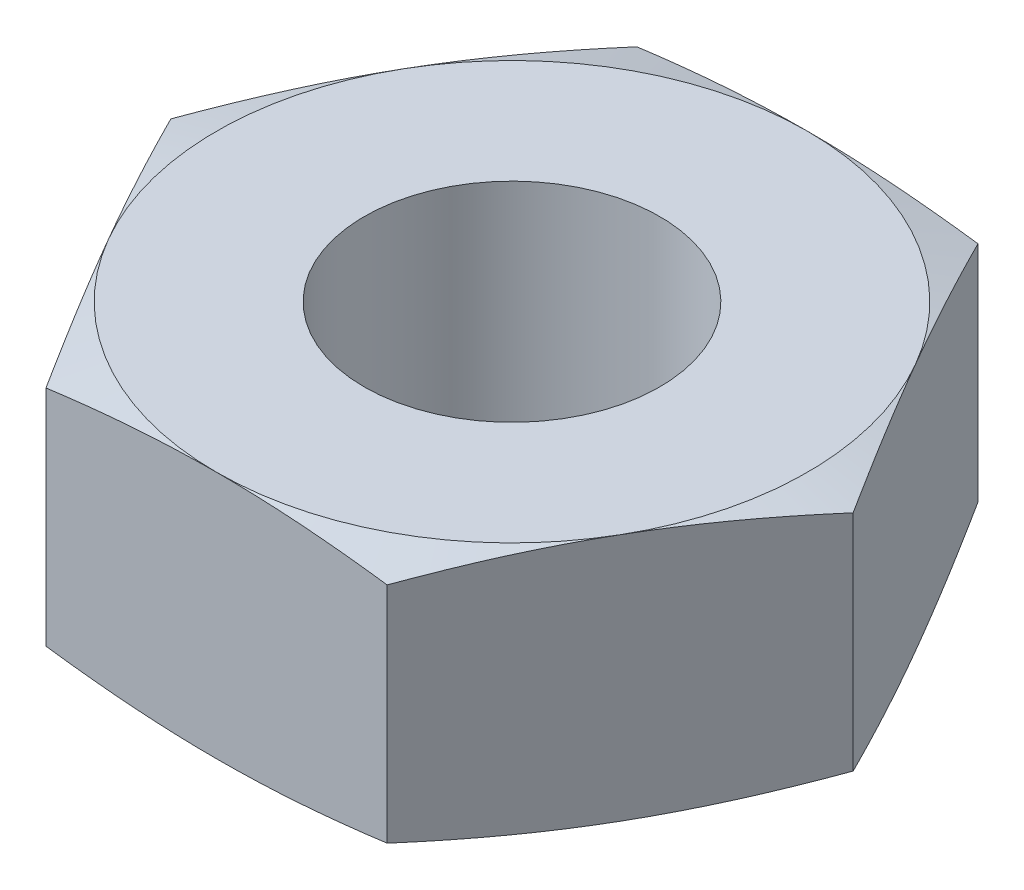
ISO-10303-21;
HEADER;
FILE_DESCRIPTION(('STEP AP214'),'2;1');
FILE_NAME('part.step','',(''),(''),'','','');
FILE_SCHEMA(('AUTOMOTIVE_DESIGN { 1 0 10303 214 1 1 1 1 }'));
ENDSEC;
DATA;
#1=APPLICATION_CONTEXT('core data for automotive mechanical design processes');
#2=APPLICATION_PROTOCOL_DEFINITION('international standard','automotive_design',2000,#1);
#3=PRODUCT_CONTEXT('',#1,'mechanical');
#4=PRODUCT('Part','Part','',(#3));
#5=PRODUCT_RELATED_PRODUCT_CATEGORY('part','',(#4));
#6=PRODUCT_DEFINITION_FORMATION('','',#4);
#7=PRODUCT_DEFINITION_CONTEXT('part definition',#1,'design');
#8=PRODUCT_DEFINITION('design','',#6,#7);
#9=PRODUCT_DEFINITION_SHAPE('','',#8);
#10=(LENGTH_UNIT() NAMED_UNIT(*) SI_UNIT(.MILLI.,.METRE.));
#11=(NAMED_UNIT(*) PLANE_ANGLE_UNIT() SI_UNIT($,.RADIAN.));
#12=(NAMED_UNIT(*) SI_UNIT($,.STERADIAN.) SOLID_ANGLE_UNIT());
#13=UNCERTAINTY_MEASURE_WITH_UNIT(LENGTH_MEASURE(1.E-05),#10,'distance_accuracy_value','');
#14=(GEOMETRIC_REPRESENTATION_CONTEXT(3) GLOBAL_UNCERTAINTY_ASSIGNED_CONTEXT((#13)) GLOBAL_UNIT_ASSIGNED_CONTEXT((#10,
#11,#12)) REPRESENTATION_CONTEXT('',''));
#15=CARTESIAN_POINT('',(0.,0.,0.));
#16=DIRECTION('',(0.,0.,1.));
#17=DIRECTION('',(1.,0.,0.));
#18=AXIS2_PLACEMENT_3D('',#15,#16,#17);
#19=CARTESIAN_POINT('',(0.,2.1,0.));
#20=DIRECTION('',(0.,1.,0.));
#21=DIRECTION('',(0.,0.,1.));
#22=AXIS2_PLACEMENT_3D('',#19,#20,#21);
#23=PLANE('',#22);
#24=CARTESIAN_POINT('',(0.,2.1,0.));
#25=DIRECTION('',(0.,1.,0.));
#26=DIRECTION('',(0.,0.,1.));
#27=AXIS2_PLACEMENT_3D('',#24,#25,#26);
#28=CIRCLE('',#27,1.25);
#29=CARTESIAN_POINT('',(0.,2.1,1.25));
#30=VERTEX_POINT('',#29);
#31=EDGE_CURVE('E259',#30,#30,#28,.T.);
#32=ORIENTED_EDGE('',*,*,#31,.F.);
#33=EDGE_LOOP('',(#32));
#34=FACE_BOUND('',#33,.T.);
#35=CARTESIAN_POINT('',(0.,2.1,0.));
#36=DIRECTION('',(0.,1.,0.));
#37=DIRECTION('',(0.,0.,1.));
#38=AXIS2_PLACEMENT_3D('',#35,#36,#37);
#39=CIRCLE('',#38,2.5);
#40=CARTESIAN_POINT('',(0.,2.1,2.5));
#41=VERTEX_POINT('',#40);
#42=CARTESIAN_POINT('',(-2.1650635094611,2.1,1.25));
#43=VERTEX_POINT('',#42);
#44=EDGE_CURVE('E11',#41,#43,#39,.F.);
#45=ORIENTED_EDGE('',*,*,#44,.F.);
#46=CARTESIAN_POINT('',(0.,2.1,0.));
#47=DIRECTION('',(0.,1.,0.));
#48=DIRECTION('',(0.,0.,1.));
#49=AXIS2_PLACEMENT_3D('',#46,#47,#48);
#50=CIRCLE('',#49,2.5);
#51=CARTESIAN_POINT('',(2.1650635094611,2.1,1.25));
#52=VERTEX_POINT('',#51);
#53=EDGE_CURVE('E158',#41,#52,#50,.T.);
#54=ORIENTED_EDGE('',*,*,#53,.T.);
#55=CARTESIAN_POINT('',(2.1650635094611,2.1,-1.25));
#56=VERTEX_POINT('',#55);
#57=EDGE_CURVE('E52',#56,#52,#39,.F.);
#58=ORIENTED_EDGE('',*,*,#57,.F.);
#59=CARTESIAN_POINT('',(0.,2.1,-2.5));
#60=VERTEX_POINT('',#59);
#61=EDGE_CURVE('E283',#60,#56,#39,.F.);
#62=ORIENTED_EDGE('',*,*,#61,.F.);
#63=CARTESIAN_POINT('',(-2.1650635094611,2.1,-1.25));
#64=VERTEX_POINT('',#63);
#65=EDGE_CURVE('E326',#64,#60,#39,.F.);
#66=ORIENTED_EDGE('',*,*,#65,.F.);
#67=EDGE_CURVE('E55',#43,#64,#39,.F.);
#68=ORIENTED_EDGE('',*,*,#67,.F.);
#69=EDGE_LOOP('',(#45,#54,#58,#62,#66,#68));
#70=FACE_BOUND('',#69,.T.);
#71=ADVANCED_FACE('F43',(#34,#70),#23,.T.);
#72=CARTESIAN_POINT('',(0.,0.,0.));
#73=DIRECTION('',(0.,1.,0.));
#74=DIRECTION('',(0.,0.,1.));
#75=AXIS2_PLACEMENT_3D('',#72,#73,#74);
#76=PLANE('',#75);
#77=CARTESIAN_POINT('',(0.,0.,0.));
#78=DIRECTION('',(0.,1.,0.));
#79=DIRECTION('',(0.,0.,1.));
#80=AXIS2_PLACEMENT_3D('',#77,#78,#79);
#81=CIRCLE('',#80,1.25);
#82=CARTESIAN_POINT('',(0.,0.,1.25));
#83=VERTEX_POINT('',#82);
#84=EDGE_CURVE('E265',#83,#83,#81,.T.);
#85=ORIENTED_EDGE('',*,*,#84,.T.);
#86=EDGE_LOOP('',(#85));
#87=FACE_BOUND('',#86,.T.);
#88=CARTESIAN_POINT('',(0.,0.,0.));
#89=DIRECTION('',(0.,1.,0.));
#90=DIRECTION('',(0.,0.,1.));
#91=AXIS2_PLACEMENT_3D('',#88,#89,#90);
#92=CIRCLE('',#91,2.5);
#93=CARTESIAN_POINT('',(0.,0.,2.5));
#94=VERTEX_POINT('',#93);
#95=CARTESIAN_POINT('',(2.1650635094611,0.,1.25));
#96=VERTEX_POINT('',#95);
#97=EDGE_CURVE('E151',#94,#96,#92,.T.);
#98=ORIENTED_EDGE('',*,*,#97,.F.);
#99=CARTESIAN_POINT('',(0.,0.,0.));
#100=DIRECTION('',(0.,1.,0.));
#101=DIRECTION('',(0.,0.,1.));
#102=AXIS2_PLACEMENT_3D('',#99,#100,#101);
#103=CIRCLE('',#102,2.5);
#104=CARTESIAN_POINT('',(-2.1650635094611,0.,1.25));
#105=VERTEX_POINT('',#104);
#106=EDGE_CURVE('E164',#94,#105,#103,.F.);
#107=ORIENTED_EDGE('',*,*,#106,.T.);
#108=CARTESIAN_POINT('',(-2.1650635094611,0.,-1.25));
#109=VERTEX_POINT('',#108);
#110=EDGE_CURVE('E279',#105,#109,#103,.F.);
#111=ORIENTED_EDGE('',*,*,#110,.T.);
#112=CARTESIAN_POINT('',(0.,0.,-2.5));
#113=VERTEX_POINT('',#112);
#114=EDGE_CURVE('E285',#109,#113,#103,.F.);
#115=ORIENTED_EDGE('',*,*,#114,.T.);
#116=CARTESIAN_POINT('',(2.1650635094611,0.,-1.25));
#117=VERTEX_POINT('',#116);
#118=EDGE_CURVE('E162',#113,#117,#103,.F.);
#119=ORIENTED_EDGE('',*,*,#118,.T.);
#120=EDGE_CURVE('E139',#117,#96,#103,.F.);
#121=ORIENTED_EDGE('',*,*,#120,.T.);
#122=EDGE_LOOP('',(#98,#107,#111,#115,#119,#121));
#123=FACE_BOUND('',#122,.T.);
#124=ADVANCED_FACE('F159',(#87,#123),#76,.F.);
#125=CARTESIAN_POINT('',(0.,2.1,0.));
#126=DIRECTION('',(0.,1.,0.));
#127=DIRECTION('',(0.,0.,1.));
#128=AXIS2_PLACEMENT_3D('',#125,#126,#127);
#129=CYLINDRICAL_SURFACE('',#128,1.25);
#130=ORIENTED_EDGE('',*,*,#84,.F.);
#131=EDGE_LOOP('',(#130));
#132=FACE_BOUND('',#131,.T.);
#133=ORIENTED_EDGE('',*,*,#31,.T.);
#134=EDGE_LOOP('',(#133));
#135=FACE_BOUND('',#134,.T.);
#136=ADVANCED_FACE('F195',(#132,#135),#129,.F.);
#137=CARTESIAN_POINT('',(0.,0.,0.));
#138=DIRECTION('',(0.,1.,0.));
#139=DIRECTION('',(0.,0.,1.));
#140=AXIS2_PLACEMENT_3D('',#137,#138,#139);
#141=CONICAL_SURFACE('',#140,2.5,1.30899693899574);
#142=CARTESIAN_POINT('',(-4.3712350475131,0.679423372215923,2.5));
#143=CARTESIAN_POINT('',(-4.26551433291152,0.654835283850598,2.5));
#144=CARTESIAN_POINT('',(-4.15974613150584,0.630451423546869,2.5));
#145=CARTESIAN_POINT('',(-3.94809483123509,0.582179859675812,2.5));
#146=CARTESIAN_POINT('',(-3.84221173052944,0.558292164183879,2.5));
#147=CARTESIAN_POINT('',(-3.52432514486568,0.487497117461189,2.5));
#148=CARTESIAN_POINT('',(-3.31212448441136,0.441467204275446,2.5));
#149=CARTESIAN_POINT('',(-2.88500139302484,0.352382090715466,2.5));
#150=CARTESIAN_POINT('',(-2.67007218491964,0.309359092584015,2.5));
#151=CARTESIAN_POINT('',(-2.2392063533858,0.228471660371487,2.5));
#152=CARTESIAN_POINT('',(-2.02326964124852,0.190607689748078,2.5));
#153=CARTESIAN_POINT('',(-1.59602529116294,0.123552258428044,2.5));
#154=CARTESIAN_POINT('',(-1.38475101184777,0.0941533743212326,2.5));
#155=CARTESIAN_POINT('',(-0.960988743608423,0.0459589657265004,2.5));
#156=CARTESIAN_POINT('',(-0.748501162895277,0.0271600653836444,2.5));
#157=CARTESIAN_POINT('',(-0.429666662596568,0.00925008349405404,2.5));
#158=CARTESIAN_POINT('',(-0.323601530991883,0.00499298887421524,2.5));
#159=CARTESIAN_POINT('',(-0.111385131410139,6.74118896243829E-05,2.5));
#160=CARTESIAN_POINT('',(-0.00523386386546361,-0.000601088379031025,2.5));
#161=CARTESIAN_POINT('',(0.207036213487213,0.00169184566061242,2.5));
#162=CARTESIAN_POINT('',(0.313155020383301,0.00465354320105018,2.5));
#163=CARTESIAN_POINT('',(0.525235296004603,0.014050004975312,2.5));
#164=CARTESIAN_POINT('',(0.631196764835219,0.0204847668814326,2.5));
#165=CARTESIAN_POINT('',(0.88885387992793,0.0400086756720292,2.5));
#166=CARTESIAN_POINT('',(1.04042248684079,0.0547741958964136,2.5));
#167=CARTESIAN_POINT('',(1.34292021156248,0.0896456156755545,2.5));
#168=CARTESIAN_POINT('',(1.49384935133984,0.109751330234546,2.5));
#169=CARTESIAN_POINT('',(1.79556831872567,0.154179595891873,2.5));
#170=CARTESIAN_POINT('',(1.94635616677979,0.178515391424525,2.5));
#171=CARTESIAN_POINT('',(2.24738817378403,0.230350760958722,2.5));
#172=CARTESIAN_POINT('',(2.39763230519546,0.257850492959668,2.5));
#173=CARTESIAN_POINT('',(2.70076543170808,0.315824485387797,2.5));
#174=CARTESIAN_POINT('',(2.85364483504102,0.346348515840964,2.5));
#175=CARTESIAN_POINT('',(3.15901863091299,0.409263443255877,2.5));
#176=CARTESIAN_POINT('',(3.3115130190346,0.441654361536492,2.5));
#177=CARTESIAN_POINT('',(3.61535530056918,0.507668546812496,2.5));
#178=CARTESIAN_POINT('',(3.76670488717378,0.541284057339461,2.5));
#179=CARTESIAN_POINT('',(4.06914616411175,0.60960869991724,2.5));
#180=CARTESIAN_POINT('',(4.22023787189201,0.644317754619726,2.5));
#181=CARTESIAN_POINT('',(4.3712350475131,0.679423372215923,2.5));
#182=B_SPLINE_CURVE_WITH_KNOTS('',3,(#142,#143,#144,#145,#146,#147,#148,#149,#150,#151,#152,
#153,#154,#155,#156,#157,#158,#159,#160,#161,#162,#163,#164,#165,#166,#167,#168,#169,#170,#171,
#172,#173,#174,#175,#176,#177,#178,#179,#180,#181),.UNSPECIFIED.,.F.,.F.,(4,2,2,2,2,2,2,2,2,2,2,
2,2,2,2,2,2,2,2,4),(0.,0.325626625694674,0.651258547022556,1.30264596765056,1.96018571580165,
2.61778449469,3.25754187391862,3.89709538965373,4.21549355816424,4.53389013814877,
4.85230980700493,5.17072926245139,5.62746106131332,6.08417704007103,6.5423496438233,
7.00054513755567,7.46822044928546,7.93590110267772,8.40100988776508,8.86608584841109),.UNSPECIFIED.);
#183=CARTESIAN_POINT('',(1.44337567297406,0.103629710818453,2.5));
#184=VERTEX_POINT('',#183);
#185=EDGE_CURVE('E152',#94,#184,#182,.T.);
#186=ORIENTED_EDGE('',*,*,#185,.F.);
#187=ORIENTED_EDGE('',*,*,#97,.T.);
#188=CARTESIAN_POINT('',(1.44326020292023,0.103660652782461,2.5002));
#189=CARTESIAN_POINT('',(1.50320952529874,0.0875892792306611,2.3963647277611));
#190=CARTESIAN_POINT('',(1.56326755459979,0.0729990337006399,2.29234116960921));
#191=CARTESIAN_POINT('',(1.68359574744812,0.0473652313581836,2.08392662601295));
#192=CARTESIAN_POINT('',(1.7438659871647,0.0363231156546212,1.97953550863948));
#193=CARTESIAN_POINT('',(1.86425311986789,0.0184303017580171,1.77101887822002));
#194=CARTESIAN_POINT('',(1.9243691985065,0.0115582621482163,1.66689477566615));
#195=CARTESIAN_POINT('',(2.04467803264923,0.00234354959070483,1.45851376233157));
#196=CARTESIAN_POINT('',(2.10487077105516,0.,1.35425688116578));
#197=CARTESIAN_POINT('',(2.22525624786703,0.,1.14574311883422));
#198=CARTESIAN_POINT('',(2.28544898627297,0.00234354959070469,1.04148623766844));
#199=CARTESIAN_POINT('',(2.40575782041569,0.0115582621482161,0.833105224333856));
#200=CARTESIAN_POINT('',(2.4658738990543,0.018430301758017,0.728981121779984));
#201=CARTESIAN_POINT('',(2.58626103175749,0.0363231156546209,0.520464491360524));
#202=CARTESIAN_POINT('',(2.64653127147407,0.0473652313581832,0.416073373987048));
#203=CARTESIAN_POINT('',(2.7668594643224,0.0729990337006393,0.207658830390792));
#204=CARTESIAN_POINT('',(2.82691749362346,0.0875892792306604,0.103635272238903));
#205=CARTESIAN_POINT('',(2.88686681600197,0.10366065278246,-0.000199999999999963));
#206=B_SPLINE_CURVE_WITH_KNOTS('',3,(#188,#189,#190,#191,#192,#193,#194,#195,#196,#197,#198,
#199,#200,#201,#202,#203,#204,#205),.UNSPECIFIED.,.F.,.F.,(4,2,2,2,2,2,2,2,4),(0.,
0.362931913815159,0.726011050322839,1.08721601235603,1.44835104389736,1.80948607543869,
2.17069103747188,2.53377017397956,2.89670208779472),.UNSPECIFIED.);
#207=EDGE_CURVE('E148',#184,#96,#206,.T.);
#208=ORIENTED_EDGE('',*,*,#207,.F.);
#209=EDGE_LOOP('',(#186,#187,#208));
#210=FACE_BOUND('',#209,.T.);
#211=ADVANCED_FACE('F155',(#210),#141,.T.);
#212=ORIENTED_EDGE('',*,*,#120,.F.);
#213=CARTESIAN_POINT('',(2.88686681600197,0.10366065278246,0.000199999999999978));
#214=CARTESIAN_POINT('',(2.82691749362346,0.0875892792306605,-0.103635272238904));
#215=CARTESIAN_POINT('',(2.7668594643224,0.0729990337006393,-0.207658830390792));
#216=CARTESIAN_POINT('',(2.64653127147407,0.0473652313581832,-0.416073373987048));
#217=CARTESIAN_POINT('',(2.58626103175749,0.0363231156546209,-0.520464491360524));
#218=CARTESIAN_POINT('',(2.4658738990543,0.0184303017580169,-0.728981121779984));
#219=CARTESIAN_POINT('',(2.40575782041569,0.011558262148216,-0.833105224333856));
#220=CARTESIAN_POINT('',(2.28544898627297,0.00234354959070454,-1.04148623766844));
#221=CARTESIAN_POINT('',(2.22525624786703,0.,-1.14574311883422));
#222=CARTESIAN_POINT('',(2.10487077105516,0.,-1.35425688116578));
#223=CARTESIAN_POINT('',(2.04467803264922,0.00234354959070464,-1.45851376233157));
#224=CARTESIAN_POINT('',(1.9243691985065,0.0115582621482162,-1.66689477566615));
#225=CARTESIAN_POINT('',(1.86425311986789,0.018430301758017,-1.77101887822002));
#226=CARTESIAN_POINT('',(1.7438659871647,0.0363231156546211,-1.97953550863948));
#227=CARTESIAN_POINT('',(1.68359574744812,0.0473652313581834,-2.08392662601295));
#228=CARTESIAN_POINT('',(1.56326755459979,0.0729990337006395,-2.29234116960921));
#229=CARTESIAN_POINT('',(1.50320952529873,0.0875892792306607,-2.3963647277611));
#230=CARTESIAN_POINT('',(1.44326020292023,0.103660652782461,-2.5002));
#231=B_SPLINE_CURVE_WITH_KNOTS('',3,(#213,#214,#215,#216,#217,#218,#219,#220,#221,#222,#223,
#224,#225,#226,#227,#228,#229,#230),.UNSPECIFIED.,.F.,.F.,(4,2,2,2,2,2,2,2,4),(0.,
0.362931913815159,0.726011050322839,1.08721601235603,1.44835104389736,1.80948607543869,
2.17069103747188,2.53377017397956,2.89670208779472),.UNSPECIFIED.);
#232=CARTESIAN_POINT('',(2.88675134594813,0.103629710818452,0.));
#233=VERTEX_POINT('',#232);
#234=EDGE_CURVE('E143',#233,#117,#231,.T.);
#235=ORIENTED_EDGE('',*,*,#234,.F.);
#236=EDGE_CURVE('E134',#96,#233,#206,.T.);
#237=ORIENTED_EDGE('',*,*,#236,.F.);
#238=EDGE_LOOP('',(#212,#235,#237));
#239=FACE_BOUND('',#238,.T.);
#240=ADVANCED_FACE('F136',(#239),#141,.T.);
#241=ORIENTED_EDGE('',*,*,#118,.F.);
#242=CARTESIAN_POINT('',(4.37123504751309,0.679423372215922,-2.5));
#243=CARTESIAN_POINT('',(4.26551433291152,0.654835283850596,-2.5));
#244=CARTESIAN_POINT('',(4.15974613150583,0.630451423546868,-2.5));
#245=CARTESIAN_POINT('',(3.94809483123509,0.582179859675811,-2.5));
#246=CARTESIAN_POINT('',(3.84221173052944,0.558292164183878,-2.5));
#247=CARTESIAN_POINT('',(3.52432514486567,0.487497117461189,-2.5));
#248=CARTESIAN_POINT('',(3.31212448441135,0.441467204275445,-2.5));
#249=CARTESIAN_POINT('',(2.88500139302484,0.352382090715465,-2.5));
#250=CARTESIAN_POINT('',(2.67007218491964,0.309359092584015,-2.5));
#251=CARTESIAN_POINT('',(2.23920635338579,0.228471660371486,-2.5));
#252=CARTESIAN_POINT('',(2.02326964124851,0.190607689748078,-2.5));
#253=CARTESIAN_POINT('',(1.59602529116294,0.123552258428044,-2.5));
#254=CARTESIAN_POINT('',(1.38475101184777,0.0941533743212325,-2.5));
#255=CARTESIAN_POINT('',(0.960988743608421,0.0459589657265005,-2.5));
#256=CARTESIAN_POINT('',(0.748501162895276,0.0271600653836447,-2.5));
#257=CARTESIAN_POINT('',(0.429666662596567,0.0092500834940542,-2.5));
#258=CARTESIAN_POINT('',(0.323601530991883,0.0049929888742153,-2.5));
#259=CARTESIAN_POINT('',(0.111385131410138,6.74118896244575E-05,-2.5));
#260=CARTESIAN_POINT('',(0.00523386386546345,-0.000601088379030847,-2.5));
#261=CARTESIAN_POINT('',(-0.207036213487213,0.00169184566061258,-2.5));
#262=CARTESIAN_POINT('',(-0.313155020383301,0.00465354320105024,-2.5));
#263=CARTESIAN_POINT('',(-0.525235296004603,0.0140500049753121,-2.5));
#264=CARTESIAN_POINT('',(-0.631196764835219,0.0204847668814327,-2.5));
#265=CARTESIAN_POINT('',(-0.88885387992793,0.0400086756720294,-2.5));
#266=CARTESIAN_POINT('',(-1.04042248684079,0.0547741958964137,-2.5));
#267=CARTESIAN_POINT('',(-1.34292021156248,0.0896456156755544,-2.5));
#268=CARTESIAN_POINT('',(-1.49384935133984,0.109751330234546,-2.5));
#269=CARTESIAN_POINT('',(-1.79556831872567,0.154179595891873,-2.5));
#270=CARTESIAN_POINT('',(-1.94635616677979,0.178515391424525,-2.5));
#271=CARTESIAN_POINT('',(-2.24738817378403,0.230350760958722,-2.5));
#272=CARTESIAN_POINT('',(-2.39763230519546,0.257850492959668,-2.5));
#273=CARTESIAN_POINT('',(-2.70076543170808,0.315824485387797,-2.5));
#274=CARTESIAN_POINT('',(-2.85364483504102,0.346348515840964,-2.5));
#275=CARTESIAN_POINT('',(-3.15901863091299,0.409263443255877,-2.5));
#276=CARTESIAN_POINT('',(-3.3115130190346,0.441654361536492,-2.5));
#277=CARTESIAN_POINT('',(-3.61535530056918,0.507668546812495,-2.5));
#278=CARTESIAN_POINT('',(-3.76670488717377,0.54128405733946,-2.5));
#279=CARTESIAN_POINT('',(-4.06914616411175,0.609608699917239,-2.5));
#280=CARTESIAN_POINT('',(-4.220237871892,0.644317754619726,-2.5));
#281=CARTESIAN_POINT('',(-4.3712350475131,0.679423372215922,-2.5));
#282=B_SPLINE_CURVE_WITH_KNOTS('',3,(#242,#243,#244,#245,#246,#247,#248,#249,#250,#251,#252,
#253,#254,#255,#256,#257,#258,#259,#260,#261,#262,#263,#264,#265,#266,#267,#268,#269,#270,#271,
#272,#273,#274,#275,#276,#277,#278,#279,#280,#281),.UNSPECIFIED.,.F.,.F.,(4,2,2,2,2,2,2,2,2,2,2,
2,2,2,2,2,2,2,2,4),(0.,0.325626625694674,0.651258547022556,1.30264596765056,1.96018571580165,
2.61778449469,3.25754187391861,3.89709538965373,4.21549355816423,4.53389013814876,
4.85230980700493,5.17072926245138,5.62746106131331,6.08417704007103,6.5423496438233,
7.00054513755566,7.46822044928546,7.93590110267772,8.40100988776507,8.86608584841108),.UNSPECIFIED.);
#283=CARTESIAN_POINT('',(1.44337567297406,0.103629710818452,-2.5));
#284=VERTEX_POINT('',#283);
#285=EDGE_CURVE('E232',#284,#113,#282,.T.);
#286=ORIENTED_EDGE('',*,*,#285,.F.);
#287=EDGE_CURVE('E180',#117,#284,#231,.T.);
#288=ORIENTED_EDGE('',*,*,#287,.F.);
#289=EDGE_LOOP('',(#241,#286,#288));
#290=FACE_BOUND('',#289,.T.);
#291=ADVANCED_FACE('F348',(#290),#141,.T.);
#292=ORIENTED_EDGE('',*,*,#114,.F.);
#293=CARTESIAN_POINT('',(-1.44326020292023,0.103660652782461,-2.5002));
#294=CARTESIAN_POINT('',(-1.50320952529874,0.087589279230661,-2.3963647277611));
#295=CARTESIAN_POINT('',(-1.56326755459979,0.0729990337006398,-2.29234116960921));
#296=CARTESIAN_POINT('',(-1.68359574744812,0.0473652313581836,-2.08392662601295));
#297=CARTESIAN_POINT('',(-1.7438659871647,0.0363231156546212,-1.97953550863948));
#298=CARTESIAN_POINT('',(-1.86425311986789,0.0184303017580171,-1.77101887822002));
#299=CARTESIAN_POINT('',(-1.9243691985065,0.0115582621482163,-1.66689477566615));
#300=CARTESIAN_POINT('',(-2.04467803264923,0.00234354959070487,-1.45851376233157));
#301=CARTESIAN_POINT('',(-2.10487077105516,0.,-1.35425688116578));
#302=CARTESIAN_POINT('',(-2.22525624786703,0.,-1.14574311883422));
#303=CARTESIAN_POINT('',(-2.28544898627297,0.00234354959070474,-1.04148623766843));
#304=CARTESIAN_POINT('',(-2.40575782041569,0.0115582621482162,-0.833105224333855));
#305=CARTESIAN_POINT('',(-2.4658738990543,0.0184303017580171,-0.728981121779983));
#306=CARTESIAN_POINT('',(-2.58626103175749,0.0363231156546212,-0.520464491360522));
#307=CARTESIAN_POINT('',(-2.64653127147407,0.0473652313581836,-0.416073373987047));
#308=CARTESIAN_POINT('',(-2.7668594643224,0.0729990337006398,-0.207658830390791));
#309=CARTESIAN_POINT('',(-2.82691749362346,0.087589279230661,-0.103635272238902));
#310=CARTESIAN_POINT('',(-2.88686681600197,0.103660652782461,0.000200000000001446));
#311=B_SPLINE_CURVE_WITH_KNOTS('',3,(#293,#294,#295,#296,#297,#298,#299,#300,#301,#302,#303,
#304,#305,#306,#307,#308,#309,#310),.UNSPECIFIED.,.F.,.F.,(4,2,2,2,2,2,2,2,4),(0.,
0.362931913815159,0.72601105032284,1.08721601235603,1.44835104389736,1.80948607543869,
2.17069103747189,2.53377017397957,2.89670208779473),.UNSPECIFIED.);
#312=CARTESIAN_POINT('',(-1.44337567297406,0.103629710818453,-2.5));
#313=VERTEX_POINT('',#312);
#314=EDGE_CURVE('E234',#313,#109,#311,.T.);
#315=ORIENTED_EDGE('',*,*,#314,.F.);
#316=EDGE_CURVE('E223',#113,#313,#282,.T.);
#317=ORIENTED_EDGE('',*,*,#316,.F.);
#318=EDGE_LOOP('',(#292,#315,#317));
#319=FACE_BOUND('',#318,.T.);
#320=ADVANCED_FACE('F349',(#319),#141,.T.);
#321=ORIENTED_EDGE('',*,*,#110,.F.);
#322=CARTESIAN_POINT('',(-2.88686681600197,0.103660652782461,-0.00019999999999914));
#323=CARTESIAN_POINT('',(-2.82691749362346,0.087589279230661,0.103635272238904));
#324=CARTESIAN_POINT('',(-2.7668594643224,0.0729990337006398,0.207658830390793));
#325=CARTESIAN_POINT('',(-2.64653127147407,0.0473652313581837,0.416073373987049));
#326=CARTESIAN_POINT('',(-2.58626103175749,0.0363231156546213,0.520464491360524));
#327=CARTESIAN_POINT('',(-2.4658738990543,0.0184303017580173,0.728981121779984));
#328=CARTESIAN_POINT('',(-2.4057578204157,0.0115582621482164,0.833105224333856));
#329=CARTESIAN_POINT('',(-2.28544898627297,0.00234354959070499,1.04148623766844));
#330=CARTESIAN_POINT('',(-2.22525624786703,0.,1.14574311883422));
#331=CARTESIAN_POINT('',(-2.10487077105516,0.,1.35425688116578));
#332=CARTESIAN_POINT('',(-2.04467803264923,0.002343549590705,1.45851376233157));
#333=CARTESIAN_POINT('',(-1.9243691985065,0.0115582621482165,1.66689477566614));
#334=CARTESIAN_POINT('',(-1.86425311986789,0.0184303017580173,1.77101887822002));
#335=CARTESIAN_POINT('',(-1.74386598716471,0.0363231156546213,1.97953550863948));
#336=CARTESIAN_POINT('',(-1.68359574744812,0.0473652313581837,2.08392662601295));
#337=CARTESIAN_POINT('',(-1.56326755459979,0.0729990337006399,2.29234116960921));
#338=CARTESIAN_POINT('',(-1.50320952529874,0.087589279230661,2.3963647277611));
#339=CARTESIAN_POINT('',(-1.44326020292023,0.103660652782461,2.5002));
#340=B_SPLINE_CURVE_WITH_KNOTS('',3,(#322,#323,#324,#325,#326,#327,#328,#329,#330,#331,#332,
#333,#334,#335,#336,#337,#338,#339),.UNSPECIFIED.,.F.,.F.,(4,2,2,2,2,2,2,2,4),(0.,
0.362931913815159,0.726011050322838,1.08721601235603,1.44835104389736,1.80948607543869,
2.17069103747188,2.53377017397956,2.89670208779472),.UNSPECIFIED.);
#341=CARTESIAN_POINT('',(-2.88675134594813,0.103629710818452,0.));
#342=VERTEX_POINT('',#341);
#343=EDGE_CURVE('E350',#342,#105,#340,.T.);
#344=ORIENTED_EDGE('',*,*,#343,.F.);
#345=EDGE_CURVE('E218',#109,#342,#311,.T.);
#346=ORIENTED_EDGE('',*,*,#345,.F.);
#347=EDGE_LOOP('',(#321,#344,#346));
#348=FACE_BOUND('',#347,.T.);
#349=ADVANCED_FACE('F356',(#348),#141,.T.);
#350=ORIENTED_EDGE('',*,*,#106,.F.);
#351=CARTESIAN_POINT('',(-1.44337567297407,0.103629710818453,2.5));
#352=VERTEX_POINT('',#351);
#353=EDGE_CURVE('E345',#352,#94,#182,.T.);
#354=ORIENTED_EDGE('',*,*,#353,.F.);
#355=EDGE_CURVE('E211',#105,#352,#340,.T.);
#356=ORIENTED_EDGE('',*,*,#355,.F.);
#357=EDGE_LOOP('',(#350,#354,#356));
#358=FACE_BOUND('',#357,.T.);
#359=ADVANCED_FACE('F198',(#358),#141,.T.);
#360=CARTESIAN_POINT('',(0.,1.61229508922613,0.));
#361=DIRECTION('',(0.,-1.,0.));
#362=DIRECTION('',(0.,0.,-1.));
#363=AXIS2_PLACEMENT_3D('',#360,#361,#362);
#364=CONICAL_SURFACE('',#363,4.32013950610889,1.30899693899574);
#365=ORIENTED_EDGE('',*,*,#53,.F.);
#366=CARTESIAN_POINT('',(4.3712350475131,1.42057662778408,2.5));
#367=CARTESIAN_POINT('',(4.26551433291152,1.4451647161494,2.5));
#368=CARTESIAN_POINT('',(4.15974613150584,1.46954857645313,2.5));
#369=CARTESIAN_POINT('',(3.94809483123509,1.51782014032419,2.5));
#370=CARTESIAN_POINT('',(3.84221173052944,1.54170783581612,2.5));
#371=CARTESIAN_POINT('',(3.52432514486568,1.61250288253881,2.5));
#372=CARTESIAN_POINT('',(3.31212448441135,1.65853279572455,2.5));
#373=CARTESIAN_POINT('',(2.88500139302484,1.74761790928453,2.5));
#374=CARTESIAN_POINT('',(2.67007218491964,1.79064090741599,2.5));
#375=CARTESIAN_POINT('',(2.2392063533858,1.87152833962851,2.5));
#376=CARTESIAN_POINT('',(2.02326964124852,1.90939231025192,2.5));
#377=CARTESIAN_POINT('',(1.59602529116294,1.97644774157196,2.5));
#378=CARTESIAN_POINT('',(1.38475101184777,2.00584662567877,2.5));
#379=CARTESIAN_POINT('',(0.960988743608422,2.0540410342735,2.5));
#380=CARTESIAN_POINT('',(0.748501162895276,2.07283993461636,2.5));
#381=CARTESIAN_POINT('',(0.429666662596567,2.09074991650595,2.5));
#382=CARTESIAN_POINT('',(0.323601530991883,2.09500701112579,2.5));
#383=CARTESIAN_POINT('',(0.111385131410138,2.09993258811038,2.5));
#384=CARTESIAN_POINT('',(0.0052338638654628,2.10060108837903,2.5));
#385=CARTESIAN_POINT('',(-0.207036213487213,2.09830815433939,2.5));
#386=CARTESIAN_POINT('',(-0.313155020383301,2.09534645679895,2.5));
#387=CARTESIAN_POINT('',(-0.525235296004603,2.08594999502469,2.5));
#388=CARTESIAN_POINT('',(-0.63119676483522,2.07951523311857,2.5));
#389=CARTESIAN_POINT('',(-0.888853879927931,2.05999132432797,2.5));
#390=CARTESIAN_POINT('',(-1.04042248684079,2.04522580410359,2.5));
#391=CARTESIAN_POINT('',(-1.34292021156248,2.01035438432445,2.5));
#392=CARTESIAN_POINT('',(-1.49384935133984,1.99024866976545,2.5));
#393=CARTESIAN_POINT('',(-1.79556831872567,1.94582040410813,2.5));
#394=CARTESIAN_POINT('',(-1.94635616677979,1.92148460857548,2.5));
#395=CARTESIAN_POINT('',(-2.24738817378403,1.86964923904128,2.5));
#396=CARTESIAN_POINT('',(-2.39763230519546,1.84214950704033,2.5));
#397=CARTESIAN_POINT('',(-2.70076543170808,1.7841755146122,2.5));
#398=CARTESIAN_POINT('',(-2.85364483504102,1.75365148415904,2.5));
#399=CARTESIAN_POINT('',(-3.159018630913,1.69073655674412,2.5));
#400=CARTESIAN_POINT('',(-3.3115130190346,1.65834563846351,2.5));
#401=CARTESIAN_POINT('',(-3.61535530056919,1.5923314531875,2.5));
#402=CARTESIAN_POINT('',(-3.76670488717378,1.55871594266054,2.5));
#403=CARTESIAN_POINT('',(-4.06914616411175,1.49039130008276,2.5));
#404=CARTESIAN_POINT('',(-4.22023787189201,1.45568224538027,2.5));
#405=CARTESIAN_POINT('',(-4.3712350475131,1.42057662778408,2.5));
#406=B_SPLINE_CURVE_WITH_KNOTS('',3,(#366,#367,#368,#369,#370,#371,#372,#373,#374,#375,#376,
#377,#378,#379,#380,#381,#382,#383,#384,#385,#386,#387,#388,#389,#390,#391,#392,#393,#394,#395,
#396,#397,#398,#399,#400,#401,#402,#403,#404,#405),.UNSPECIFIED.,.F.,.F.,(4,2,2,2,2,2,2,2,2,2,2,
2,2,2,2,2,2,2,2,4),(0.,0.325626625694675,0.651258547022556,1.30264596765056,1.96018571580165,
2.61778449469,3.25754187391862,3.89709538965373,4.21549355816424,4.53389013814877,
4.85230980700493,5.17072926245139,5.62746106131332,6.08417704007103,6.5423496438233,
7.00054513755567,7.46822044928547,7.93590110267772,8.40100988776508,8.86608584841109),.UNSPECIFIED.);
#407=CARTESIAN_POINT('',(1.44337567297406,1.99637028918155,2.5));
#408=VERTEX_POINT('',#407);
#409=EDGE_CURVE('E175',#408,#41,#406,.T.);
#410=ORIENTED_EDGE('',*,*,#409,.F.);
#411=CARTESIAN_POINT('',(2.88686681600197,1.99633934721754,-0.000200000000000076));
#412=CARTESIAN_POINT('',(2.82691749362346,2.01241072076934,0.103635272238904));
#413=CARTESIAN_POINT('',(2.7668594643224,2.02700096629936,0.207658830390792));
#414=CARTESIAN_POINT('',(2.64653127147407,2.05263476864182,0.416073373987048));
#415=CARTESIAN_POINT('',(2.58626103175749,2.06367688434538,0.520464491360524));
#416=CARTESIAN_POINT('',(2.4658738990543,2.08156969824198,0.728981121779984));
#417=CARTESIAN_POINT('',(2.40575782041569,2.08844173785178,0.833105224333856));
#418=CARTESIAN_POINT('',(2.28544898627297,2.0976564504093,1.04148623766844));
#419=CARTESIAN_POINT('',(2.22525624786703,2.1,1.14574311883422));
#420=CARTESIAN_POINT('',(2.10487077105516,2.1,1.35425688116578));
#421=CARTESIAN_POINT('',(2.04467803264923,2.0976564504093,1.45851376233157));
#422=CARTESIAN_POINT('',(1.9243691985065,2.08844173785178,1.66689477566615));
#423=CARTESIAN_POINT('',(1.86425311986789,2.08156969824198,1.77101887822002));
#424=CARTESIAN_POINT('',(1.7438659871647,2.06367688434538,1.97953550863948));
#425=CARTESIAN_POINT('',(1.68359574744812,2.05263476864182,2.08392662601295));
#426=CARTESIAN_POINT('',(1.56326755459979,2.02700096629936,2.29234116960921));
#427=CARTESIAN_POINT('',(1.50320952529874,2.01241072076934,2.3963647277611));
#428=CARTESIAN_POINT('',(1.44326020292023,1.99633934721754,2.5002));
#429=B_SPLINE_CURVE_WITH_KNOTS('',3,(#411,#412,#413,#414,#415,#416,#417,#418,#419,#420,#421,
#422,#423,#424,#425,#426,#427,#428),.UNSPECIFIED.,.F.,.F.,(4,2,2,2,2,2,2,2,4),(0.,
0.362931913815159,0.726011050322839,1.08721601235603,1.44835104389736,1.80948607543869,
2.17069103747188,2.53377017397956,2.89670208779472),.UNSPECIFIED.);
#430=EDGE_CURVE('E296',#52,#408,#429,.T.);
#431=ORIENTED_EDGE('',*,*,#430,.F.);
#432=EDGE_LOOP('',(#365,#410,#431));
#433=FACE_BOUND('',#432,.T.);
#434=ADVANCED_FACE('F331',(#433),#364,.T.);
#435=ORIENTED_EDGE('',*,*,#57,.T.);
#436=CARTESIAN_POINT('',(2.88675134594813,1.99637028918155,0.));
#437=VERTEX_POINT('',#436);
#438=EDGE_CURVE('E298',#437,#52,#429,.T.);
#439=ORIENTED_EDGE('',*,*,#438,.F.);
#440=CARTESIAN_POINT('',(1.44326020292023,1.99633934721754,-2.5002));
#441=CARTESIAN_POINT('',(1.50320952529873,2.01241072076934,-2.3963647277611));
#442=CARTESIAN_POINT('',(1.56326755459979,2.02700096629936,-2.29234116960921));
#443=CARTESIAN_POINT('',(1.68359574744812,2.05263476864182,-2.08392662601295));
#444=CARTESIAN_POINT('',(1.7438659871647,2.06367688434538,-1.97953550863948));
#445=CARTESIAN_POINT('',(1.86425311986789,2.08156969824198,-1.77101887822002));
#446=CARTESIAN_POINT('',(1.9243691985065,2.08844173785178,-1.66689477566615));
#447=CARTESIAN_POINT('',(2.04467803264923,2.0976564504093,-1.45851376233157));
#448=CARTESIAN_POINT('',(2.10487077105516,2.1,-1.35425688116578));
#449=CARTESIAN_POINT('',(2.22525624786703,2.1,-1.14574311883422));
#450=CARTESIAN_POINT('',(2.28544898627297,2.0976564504093,-1.04148623766844));
#451=CARTESIAN_POINT('',(2.40575782041569,2.08844173785178,-0.833105224333856));
#452=CARTESIAN_POINT('',(2.4658738990543,2.08156969824198,-0.728981121779984));
#453=CARTESIAN_POINT('',(2.58626103175749,2.06367688434538,-0.520464491360524));
#454=CARTESIAN_POINT('',(2.64653127147407,2.05263476864182,-0.416073373987048));
#455=CARTESIAN_POINT('',(2.7668594643224,2.02700096629936,-0.207658830390792));
#456=CARTESIAN_POINT('',(2.82691749362346,2.01241072076934,-0.103635272238903));
#457=CARTESIAN_POINT('',(2.88686681600197,1.99633934721754,0.000200000000000078));
#458=B_SPLINE_CURVE_WITH_KNOTS('',3,(#440,#441,#442,#443,#444,#445,#446,#447,#448,#449,#450,
#451,#452,#453,#454,#455,#456,#457),.UNSPECIFIED.,.F.,.F.,(4,2,2,2,2,2,2,2,4),(0.,
0.362931913815159,0.726011050322839,1.08721601235603,1.44835104389736,1.80948607543869,
2.17069103747188,2.53377017397957,2.89670208779472),.UNSPECIFIED.);
#459=EDGE_CURVE('E251',#56,#437,#458,.T.);
#460=ORIENTED_EDGE('',*,*,#459,.F.);
#461=EDGE_LOOP('',(#435,#439,#460));
#462=FACE_BOUND('',#461,.T.);
#463=ADVANCED_FACE('F335',(#462),#364,.T.);
#464=ORIENTED_EDGE('',*,*,#61,.T.);
#465=CARTESIAN_POINT('',(1.44337567297406,1.99637028918155,-2.5));
#466=VERTEX_POINT('',#465);
#467=EDGE_CURVE('E318',#466,#56,#458,.T.);
#468=ORIENTED_EDGE('',*,*,#467,.F.);
#469=CARTESIAN_POINT('',(-4.3712350475131,1.42057662778408,-2.5));
#470=CARTESIAN_POINT('',(-4.26551433291152,1.4451647161494,-2.5));
#471=CARTESIAN_POINT('',(-4.15974613150583,1.46954857645313,-2.5));
#472=CARTESIAN_POINT('',(-3.94809483123509,1.51782014032419,-2.5));
#473=CARTESIAN_POINT('',(-3.84221173052944,1.54170783581612,-2.5));
#474=CARTESIAN_POINT('',(-3.52432514486568,1.61250288253881,-2.5));
#475=CARTESIAN_POINT('',(-3.31212448441135,1.65853279572455,-2.5));
#476=CARTESIAN_POINT('',(-2.88500139302484,1.74761790928453,-2.5));
#477=CARTESIAN_POINT('',(-2.67007218491964,1.79064090741599,-2.5));
#478=CARTESIAN_POINT('',(-2.2392063533858,1.87152833962851,-2.5));
#479=CARTESIAN_POINT('',(-2.02326964124851,1.90939231025192,-2.5));
#480=CARTESIAN_POINT('',(-1.59602529116294,1.97644774157196,-2.5));
#481=CARTESIAN_POINT('',(-1.38475101184777,2.00584662567877,-2.5));
#482=CARTESIAN_POINT('',(-0.960988743608421,2.0540410342735,-2.5));
#483=CARTESIAN_POINT('',(-0.748501162895276,2.07283993461636,-2.5));
#484=CARTESIAN_POINT('',(-0.429666662596567,2.09074991650595,-2.5));
#485=CARTESIAN_POINT('',(-0.323601530991882,2.09500701112579,-2.5));
#486=CARTESIAN_POINT('',(-0.111385131410138,2.09993258811038,-2.5));
#487=CARTESIAN_POINT('',(-0.00523386386546344,2.10060108837903,-2.5));
#488=CARTESIAN_POINT('',(0.207036213487213,2.09830815433939,-2.5));
#489=CARTESIAN_POINT('',(0.313155020383301,2.09534645679895,-2.5));
#490=CARTESIAN_POINT('',(0.525235296004603,2.08594999502469,-2.5));
#491=CARTESIAN_POINT('',(0.631196764835219,2.07951523311857,-2.5));
#492=CARTESIAN_POINT('',(0.88885387992793,2.05999132432797,-2.5));
#493=CARTESIAN_POINT('',(1.04042248684079,2.04522580410359,-2.5));
#494=CARTESIAN_POINT('',(1.34292021156248,2.01035438432445,-2.5));
#495=CARTESIAN_POINT('',(1.49384935133984,1.99024866976545,-2.5));
#496=CARTESIAN_POINT('',(1.79556831872567,1.94582040410813,-2.5));
#497=CARTESIAN_POINT('',(1.94635616677979,1.92148460857548,-2.5));
#498=CARTESIAN_POINT('',(2.24738817378403,1.86964923904128,-2.5));
#499=CARTESIAN_POINT('',(2.39763230519546,1.84214950704033,-2.5));
#500=CARTESIAN_POINT('',(2.70076543170807,1.7841755146122,-2.5));
#501=CARTESIAN_POINT('',(2.85364483504101,1.75365148415904,-2.5));
#502=CARTESIAN_POINT('',(3.15901863091299,1.69073655674412,-2.5));
#503=CARTESIAN_POINT('',(3.3115130190346,1.65834563846351,-2.5));
#504=CARTESIAN_POINT('',(3.61535530056918,1.59233145318751,-2.5));
#505=CARTESIAN_POINT('',(3.76670488717377,1.55871594266054,-2.5));
#506=CARTESIAN_POINT('',(4.06914616411175,1.49039130008276,-2.5));
#507=CARTESIAN_POINT('',(4.220237871892,1.45568224538028,-2.5));
#508=CARTESIAN_POINT('',(4.37123504751309,1.42057662778408,-2.5));
#509=B_SPLINE_CURVE_WITH_KNOTS('',3,(#469,#470,#471,#472,#473,#474,#475,#476,#477,#478,#479,
#480,#481,#482,#483,#484,#485,#486,#487,#488,#489,#490,#491,#492,#493,#494,#495,#496,#497,#498,
#499,#500,#501,#502,#503,#504,#505,#506,#507,#508),.UNSPECIFIED.,.F.,.F.,(4,2,2,2,2,2,2,2,2,2,2,
2,2,2,2,2,2,2,2,4),(0.,0.325626625694674,0.651258547022555,1.30264596765056,1.96018571580165,
2.61778449469,3.25754187391861,3.89709538965373,4.21549355816423,4.53389013814876,
4.85230980700493,5.17072926245138,5.62746106131331,6.08417704007102,6.5423496438233,
7.00054513755566,7.46822044928546,7.93590110267771,8.40100988776507,8.86608584841108),.UNSPECIFIED.);
#510=EDGE_CURVE('E244',#60,#466,#509,.T.);
#511=ORIENTED_EDGE('',*,*,#510,.F.);
#512=EDGE_LOOP('',(#464,#468,#511));
#513=FACE_BOUND('',#512,.T.);
#514=ADVANCED_FACE('F321',(#513),#364,.T.);
#515=CARTESIAN_POINT('',(-2.88686681600197,1.99633934721754,0.000200000000000914));
#516=CARTESIAN_POINT('',(-2.82691749362346,2.01241072076934,-0.103635272238903));
#517=CARTESIAN_POINT('',(-2.7668594643224,2.02700096629936,-0.207658830390791));
#518=CARTESIAN_POINT('',(-2.64653127147407,2.05263476864182,-0.416073373987048));
#519=CARTESIAN_POINT('',(-2.58626103175749,2.06367688434538,-0.520464491360523));
#520=CARTESIAN_POINT('',(-2.4658738990543,2.08156969824198,-0.728981121779984));
#521=CARTESIAN_POINT('',(-2.40575782041569,2.08844173785178,-0.833105224333856));
#522=CARTESIAN_POINT('',(-2.28544898627297,2.0976564504093,-1.04148623766844));
#523=CARTESIAN_POINT('',(-2.22525624786703,2.1,-1.14574311883422));
#524=CARTESIAN_POINT('',(-2.10487077105516,2.1,-1.35425688116578));
#525=CARTESIAN_POINT('',(-2.04467803264923,2.0976564504093,-1.45851376233157));
#526=CARTESIAN_POINT('',(-1.9243691985065,2.08844173785178,-1.66689477566615));
#527=CARTESIAN_POINT('',(-1.86425311986789,2.08156969824198,-1.77101887822002));
#528=CARTESIAN_POINT('',(-1.7438659871647,2.06367688434538,-1.97953550863948));
#529=CARTESIAN_POINT('',(-1.68359574744812,2.05263476864182,-2.08392662601295));
#530=CARTESIAN_POINT('',(-1.56326755459979,2.02700096629936,-2.29234116960921));
#531=CARTESIAN_POINT('',(-1.50320952529873,2.01241072076934,-2.3963647277611));
#532=CARTESIAN_POINT('',(-1.44326020292023,1.99633934721754,-2.5002));
#533=B_SPLINE_CURVE_WITH_KNOTS('',3,(#515,#516,#517,#518,#519,#520,#521,#522,#523,#524,#525,
#526,#527,#528,#529,#530,#531,#532),.UNSPECIFIED.,.F.,.F.,(4,2,2,2,2,2,2,2,4),(0.,
0.362931913815159,0.72601105032284,1.08721601235603,1.44835104389736,1.80948607543869,
2.17069103747189,2.53377017397957,2.89670208779473),.UNSPECIFIED.);
#534=CARTESIAN_POINT('',(-1.44337567297406,1.99637028918155,-2.5));
#535=VERTEX_POINT('',#534);
#536=EDGE_CURVE('E67',#64,#535,#533,.T.);
#537=ORIENTED_EDGE('',*,*,#536,.F.);
#538=ORIENTED_EDGE('',*,*,#65,.T.);
#539=EDGE_CURVE('E252',#535,#60,#509,.T.);
#540=ORIENTED_EDGE('',*,*,#539,.F.);
#541=EDGE_LOOP('',(#537,#538,#540));
#542=FACE_BOUND('',#541,.T.);
#543=ADVANCED_FACE('F197',(#542),#364,.T.);
#544=CARTESIAN_POINT('',(-1.44326020292023,1.99633934721754,2.5002));
#545=CARTESIAN_POINT('',(-1.50320952529874,2.01241072076934,2.3963647277611));
#546=CARTESIAN_POINT('',(-1.56326755459979,2.02700096629936,2.29234116960921));
#547=CARTESIAN_POINT('',(-1.68359574744812,2.05263476864182,2.08392662601295));
#548=CARTESIAN_POINT('',(-1.74386598716471,2.06367688434538,1.97953550863948));
#549=CARTESIAN_POINT('',(-1.86425311986789,2.08156969824198,1.77101887822002));
#550=CARTESIAN_POINT('',(-1.9243691985065,2.08844173785178,1.66689477566615));
#551=CARTESIAN_POINT('',(-2.04467803264923,2.0976564504093,1.45851376233157));
#552=CARTESIAN_POINT('',(-2.10487077105516,2.1,1.35425688116578));
#553=CARTESIAN_POINT('',(-2.22525624786703,2.1,1.14574311883422));
#554=CARTESIAN_POINT('',(-2.28544898627297,2.0976564504093,1.04148623766844));
#555=CARTESIAN_POINT('',(-2.40575782041569,2.08844173785178,0.833105224333857));
#556=CARTESIAN_POINT('',(-2.4658738990543,2.08156969824198,0.728981121779985));
#557=CARTESIAN_POINT('',(-2.58626103175749,2.06367688434538,0.520464491360525));
#558=CARTESIAN_POINT('',(-2.64653127147407,2.05263476864182,0.416073373987049));
#559=CARTESIAN_POINT('',(-2.7668594643224,2.02700096629936,0.207658830390793));
#560=CARTESIAN_POINT('',(-2.82691749362346,2.01241072076934,0.103635272238905));
#561=CARTESIAN_POINT('',(-2.88686681600197,1.99633934721754,-0.000199999999998699));
#562=B_SPLINE_CURVE_WITH_KNOTS('',3,(#544,#545,#546,#547,#548,#549,#550,#551,#552,#553,#554,
#555,#556,#557,#558,#559,#560,#561),.UNSPECIFIED.,.F.,.F.,(4,2,2,2,2,2,2,2,4),(0.,
0.362931913815158,0.726011050322838,1.08721601235603,1.44835104389736,1.80948607543869,
2.17069103747188,2.53377017397956,2.89670208779472),.UNSPECIFIED.);
#563=CARTESIAN_POINT('',(-2.88675134594813,1.99637028918155,0.));
#564=VERTEX_POINT('',#563);
#565=EDGE_CURVE('E58',#43,#564,#562,.T.);
#566=ORIENTED_EDGE('',*,*,#565,.F.);
#567=ORIENTED_EDGE('',*,*,#67,.T.);
#568=EDGE_CURVE('E301',#564,#64,#533,.T.);
#569=ORIENTED_EDGE('',*,*,#568,.F.);
#570=EDGE_LOOP('',(#566,#567,#569));
#571=FACE_BOUND('',#570,.T.);
#572=ADVANCED_FACE('F464',(#571),#364,.T.);
#573=CARTESIAN_POINT('',(-1.44337567297407,1.99637028918155,2.5));
#574=VERTEX_POINT('',#573);
#575=EDGE_CURVE('E168',#41,#574,#406,.T.);
#576=ORIENTED_EDGE('',*,*,#575,.F.);
#577=ORIENTED_EDGE('',*,*,#44,.T.);
#578=EDGE_CURVE('E302',#574,#43,#562,.T.);
#579=ORIENTED_EDGE('',*,*,#578,.F.);
#580=EDGE_LOOP('',(#576,#577,#579));
#581=FACE_BOUND('',#580,.T.);
#582=ADVANCED_FACE('F344',(#581),#364,.T.);
#583=CARTESIAN_POINT('',(-1.44337567297407,2.1,2.5));
#584=DIRECTION('',(0.,0.,-1.));
#585=DIRECTION('',(-1.,0.,0.));
#586=AXIS2_PLACEMENT_3D('',#583,#584,#585);
#587=PLANE('',#586);
#588=DIRECTION('',(0.,-1.,0.));
#589=VECTOR('',#588,1.);
#590=CARTESIAN_POINT('',(-1.44337567297407,2.1,2.5));
#591=LINE('',#590,#589);
#592=EDGE_CURVE('E266',#574,#352,#591,.T.);
#593=ORIENTED_EDGE('',*,*,#592,.T.);
#594=ORIENTED_EDGE('',*,*,#353,.T.);
#595=ORIENTED_EDGE('',*,*,#185,.T.);
#596=DIRECTION('',(0.,-1.,0.));
#597=VECTOR('',#596,1.);
#598=CARTESIAN_POINT('',(1.44337567297406,2.1,2.5));
#599=LINE('',#598,#597);
#600=EDGE_CURVE('E166',#408,#184,#599,.T.);
#601=ORIENTED_EDGE('',*,*,#600,.F.);
#602=ORIENTED_EDGE('',*,*,#409,.T.);
#603=ORIENTED_EDGE('',*,*,#575,.T.);
#604=EDGE_LOOP('',(#593,#594,#595,#601,#602,#603));
#605=FACE_BOUND('',#604,.T.);
#606=ADVANCED_FACE('F343',(#605),#587,.F.);
#607=CARTESIAN_POINT('',(-2.88675134594813,2.1,0.));
#608=DIRECTION('',(0.866025403784439,0.,-0.5));
#609=DIRECTION('',(-0.5,0.,-0.866025403784439));
#610=AXIS2_PLACEMENT_3D('',#607,#608,#609);
#611=PLANE('',#610);
#612=DIRECTION('',(0.,-1.,0.));
#613=VECTOR('',#612,1.);
#614=CARTESIAN_POINT('',(-2.88675134594813,2.1,0.));
#615=LINE('',#614,#613);
#616=EDGE_CURVE('E267',#564,#342,#615,.T.);
#617=ORIENTED_EDGE('',*,*,#616,.T.);
#618=ORIENTED_EDGE('',*,*,#343,.T.);
#619=ORIENTED_EDGE('',*,*,#355,.T.);
#620=ORIENTED_EDGE('',*,*,#592,.F.);
#621=ORIENTED_EDGE('',*,*,#578,.T.);
#622=ORIENTED_EDGE('',*,*,#565,.T.);
#623=EDGE_LOOP('',(#617,#618,#619,#620,#621,#622));
#624=FACE_BOUND('',#623,.T.);
#625=ADVANCED_FACE('F337',(#624),#611,.F.);
#626=CARTESIAN_POINT('',(-1.44337567297406,2.1,-2.5));
#627=DIRECTION('',(0.866025403784439,0.,0.5));
#628=DIRECTION('',(0.5,0.,-0.866025403784439));
#629=AXIS2_PLACEMENT_3D('',#626,#627,#628);
#630=PLANE('',#629);
#631=DIRECTION('',(0.,-1.,0.));
#632=VECTOR('',#631,1.);
#633=CARTESIAN_POINT('',(-1.44337567297406,2.1,-2.5));
#634=LINE('',#633,#632);
#635=EDGE_CURVE('E275',#535,#313,#634,.T.);
#636=ORIENTED_EDGE('',*,*,#635,.T.);
#637=ORIENTED_EDGE('',*,*,#314,.T.);
#638=ORIENTED_EDGE('',*,*,#345,.T.);
#639=ORIENTED_EDGE('',*,*,#616,.F.);
#640=ORIENTED_EDGE('',*,*,#568,.T.);
#641=ORIENTED_EDGE('',*,*,#536,.T.);
#642=EDGE_LOOP('',(#636,#637,#638,#639,#640,#641));
#643=FACE_BOUND('',#642,.T.);
#644=ADVANCED_FACE('F236',(#643),#630,.F.);
#645=CARTESIAN_POINT('',(1.44337567297406,2.1,-2.5));
#646=DIRECTION('',(0.,0.,1.));
#647=DIRECTION('',(1.,0.,0.));
#648=AXIS2_PLACEMENT_3D('',#645,#646,#647);
#649=PLANE('',#648);
#650=DIRECTION('',(0.,-1.,0.));
#651=VECTOR('',#650,1.);
#652=CARTESIAN_POINT('',(1.44337567297406,2.1,-2.5));
#653=LINE('',#652,#651);
#654=EDGE_CURVE('E274',#466,#284,#653,.T.);
#655=ORIENTED_EDGE('',*,*,#654,.T.);
#656=ORIENTED_EDGE('',*,*,#285,.T.);
#657=ORIENTED_EDGE('',*,*,#316,.T.);
#658=ORIENTED_EDGE('',*,*,#635,.F.);
#659=ORIENTED_EDGE('',*,*,#539,.T.);
#660=ORIENTED_EDGE('',*,*,#510,.T.);
#661=EDGE_LOOP('',(#655,#656,#657,#658,#659,#660));
#662=FACE_BOUND('',#661,.T.);
#663=ADVANCED_FACE('F233',(#662),#649,.F.);
#664=CARTESIAN_POINT('',(2.88675134594813,2.1,0.));
#665=DIRECTION('',(-0.866025403784439,0.,0.5));
#666=DIRECTION('',(0.5,0.,0.866025403784439));
#667=AXIS2_PLACEMENT_3D('',#664,#665,#666);
#668=PLANE('',#667);
#669=DIRECTION('',(0.,-1.,0.));
#670=VECTOR('',#669,1.);
#671=CARTESIAN_POINT('',(2.88675134594813,2.1,0.));
#672=LINE('',#671,#670);
#673=EDGE_CURVE('E163',#437,#233,#672,.T.);
#674=ORIENTED_EDGE('',*,*,#673,.T.);
#675=ORIENTED_EDGE('',*,*,#234,.T.);
#676=ORIENTED_EDGE('',*,*,#287,.T.);
#677=ORIENTED_EDGE('',*,*,#654,.F.);
#678=ORIENTED_EDGE('',*,*,#467,.T.);
#679=ORIENTED_EDGE('',*,*,#459,.T.);
#680=EDGE_LOOP('',(#674,#675,#676,#677,#678,#679));
#681=FACE_BOUND('',#680,.T.);
#682=ADVANCED_FACE('F240',(#681),#668,.F.);
#683=CARTESIAN_POINT('',(1.44337567297406,2.1,2.5));
#684=DIRECTION('',(-0.866025403784439,0.,-0.5));
#685=DIRECTION('',(-0.5,0.,0.866025403784439));
#686=AXIS2_PLACEMENT_3D('',#683,#684,#685);
#687=PLANE('',#686);
#688=ORIENTED_EDGE('',*,*,#600,.T.);
#689=ORIENTED_EDGE('',*,*,#207,.T.);
#690=ORIENTED_EDGE('',*,*,#236,.T.);
#691=ORIENTED_EDGE('',*,*,#673,.F.);
#692=ORIENTED_EDGE('',*,*,#438,.T.);
#693=ORIENTED_EDGE('',*,*,#430,.T.);
#694=EDGE_LOOP('',(#688,#689,#690,#691,#692,#693));
#695=FACE_BOUND('',#694,.T.);
#696=ADVANCED_FACE('F44',(#695),#687,.F.);
#697=CLOSED_SHELL('',(#71,#124,#136,#211,#240,#291,#320,#349,#359,#434,#463,#514,#543,#572,#582,
#606,#625,#644,#663,#682,#696));
#698=MANIFOLD_SOLID_BREP('B2',#697);
#699=ADVANCED_BREP_SHAPE_REPRESENTATION('',(#18,#698),#14);
#700=SHAPE_DEFINITION_REPRESENTATION(#9,#699);
ENDSEC;
END-ISO-10303-21;
